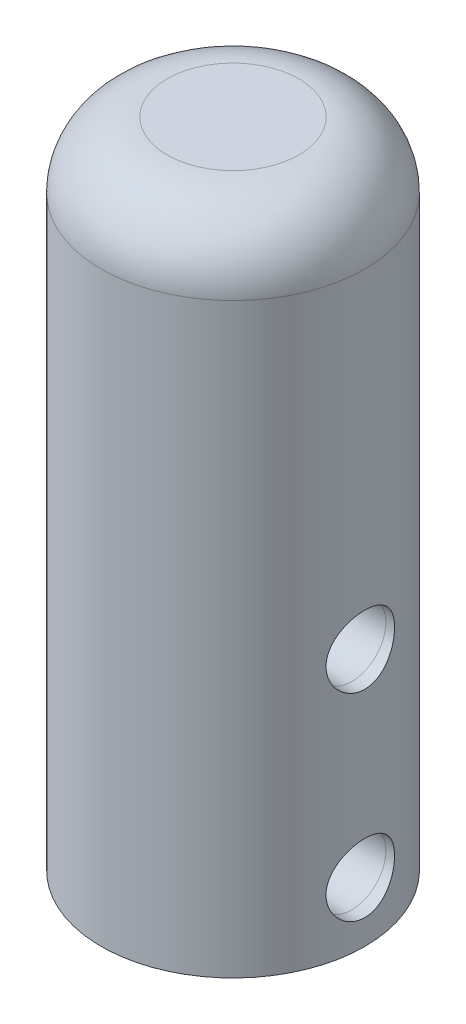
ISO-10303-21;
HEADER;
FILE_DESCRIPTION(('STEP AP214'),'2;1');
FILE_NAME('part.step','',(''),(''),'','','');
FILE_SCHEMA(('AUTOMOTIVE_DESIGN { 1 0 10303 214 1 1 1 1 }'));
ENDSEC;
DATA;
#1=APPLICATION_CONTEXT('core data for automotive mechanical design processes');
#2=APPLICATION_PROTOCOL_DEFINITION('international standard','automotive_design',2000,#1);
#3=PRODUCT_CONTEXT('',#1,'mechanical');
#4=PRODUCT('Part','Part','',(#3));
#5=PRODUCT_RELATED_PRODUCT_CATEGORY('part','',(#4));
#6=PRODUCT_DEFINITION_FORMATION('','',#4);
#7=PRODUCT_DEFINITION_CONTEXT('part definition',#1,'design');
#8=PRODUCT_DEFINITION('design','',#6,#7);
#9=PRODUCT_DEFINITION_SHAPE('','',#8);
#10=(LENGTH_UNIT() NAMED_UNIT(*) SI_UNIT(.MILLI.,.METRE.));
#11=(NAMED_UNIT(*) PLANE_ANGLE_UNIT() SI_UNIT($,.RADIAN.));
#12=(NAMED_UNIT(*) SI_UNIT($,.STERADIAN.) SOLID_ANGLE_UNIT());
#13=UNCERTAINTY_MEASURE_WITH_UNIT(LENGTH_MEASURE(1.E-05),#10,'distance_accuracy_value','');
#14=(GEOMETRIC_REPRESENTATION_CONTEXT(3) GLOBAL_UNCERTAINTY_ASSIGNED_CONTEXT((#13)) GLOBAL_UNIT_ASSIGNED_CONTEXT((#10,
#11,#12)) REPRESENTATION_CONTEXT('',''));
#15=CARTESIAN_POINT('',(0.,0.,0.));
#16=DIRECTION('',(0.,0.,1.));
#17=DIRECTION('',(1.,0.,0.));
#18=AXIS2_PLACEMENT_3D('',#15,#16,#17);
#19=CARTESIAN_POINT('',(-33.645,95.,0.));
#20=DIRECTION('',(1.,0.,0.));
#21=DIRECTION('',(0.,0.,1.));
#22=AXIS2_PLACEMENT_3D('',#19,#20,#21);
#23=CYLINDRICAL_SURFACE('',#22,1.70000000000001);
#24=CARTESIAN_POINT('',(-27.545,95.,0.));
#25=DIRECTION('',(1.,0.,0.));
#26=DIRECTION('',(0.,-1.,0.));
#27=AXIS2_PLACEMENT_3D('',#24,#25,#26);
#28=CIRCLE('',#27,1.70000000000001);
#29=CARTESIAN_POINT('',(-27.545,93.3,0.));
#30=VERTEX_POINT('',#29);
#31=EDGE_CURVE('E154',#30,#30,#28,.T.);
#32=ORIENTED_EDGE('',*,*,#31,.T.);
#33=EDGE_LOOP('',(#32));
#34=FACE_BOUND('',#33,.T.);
#35=CARTESIAN_POINT('',(-30.145,95.,0.));
#36=DIRECTION('',(1.,0.,0.));
#37=DIRECTION('',(0.,-1.,0.));
#38=AXIS2_PLACEMENT_3D('',#35,#36,#37);
#39=CIRCLE('',#38,1.70000000000001);
#40=CARTESIAN_POINT('',(-30.145,93.3,0.));
#41=VERTEX_POINT('',#40);
#42=EDGE_CURVE('E205',#41,#41,#39,.F.);
#43=ORIENTED_EDGE('',*,*,#42,.T.);
#44=EDGE_LOOP('',(#43));
#45=FACE_BOUND('',#44,.T.);
#46=ADVANCED_FACE('F41',(#34,#45),#23,.F.);
#47=CARTESIAN_POINT('',(-33.645,80.,0.));
#48=DIRECTION('',(1.,0.,0.));
#49=DIRECTION('',(0.,0.,1.));
#50=AXIS2_PLACEMENT_3D('',#47,#48,#49);
#51=CYLINDRICAL_SURFACE('',#50,1.70000000000001);
#52=CARTESIAN_POINT('',(-27.545,80.,0.));
#53=DIRECTION('',(1.,0.,0.));
#54=DIRECTION('',(0.,-1.,0.));
#55=AXIS2_PLACEMENT_3D('',#52,#53,#54);
#56=CIRCLE('',#55,1.70000000000001);
#57=CARTESIAN_POINT('',(-27.545,78.3,0.));
#58=VERTEX_POINT('',#57);
#59=EDGE_CURVE('E128',#58,#58,#56,.T.);
#60=ORIENTED_EDGE('',*,*,#59,.T.);
#61=EDGE_LOOP('',(#60));
#62=FACE_BOUND('',#61,.T.);
#63=CARTESIAN_POINT('',(-30.145,80.,0.));
#64=DIRECTION('',(1.,0.,0.));
#65=DIRECTION('',(0.,-1.,0.));
#66=AXIS2_PLACEMENT_3D('',#63,#64,#65);
#67=CIRCLE('',#66,1.70000000000001);
#68=CARTESIAN_POINT('',(-30.145,78.3,0.));
#69=VERTEX_POINT('',#68);
#70=EDGE_CURVE('E344',#69,#69,#67,.F.);
#71=ORIENTED_EDGE('',*,*,#70,.T.);
#72=EDGE_LOOP('',(#71));
#73=FACE_BOUND('',#72,.T.);
#74=ADVANCED_FACE('F192',(#62,#73),#51,.F.);
#75=CARTESIAN_POINT('',(-23.645,46.7157287525381,0.));
#76=DIRECTION('',(0.,1.,0.));
#77=DIRECTION('',(-1.,0.,0.));
#78=AXIS2_PLACEMENT_3D('',#75,#76,#77);
#79=CYLINDRICAL_SURFACE('',#78,10.);
#80=CARTESIAN_POINT('',(-33.645,77.15,0.));
#81=CARTESIAN_POINT('',(-33.6449981148392,77.1500028038685,-0.156702222055426));
#82=CARTESIAN_POINT('',(-33.6412809618987,77.1629670882105,-0.313433312054446));
#83=CARTESIAN_POINT('',(-33.6268145988117,77.2143732014747,-0.622353947826402));
#84=CARTESIAN_POINT('',(-33.6160626998475,77.2528247722106,-0.774541733793407));
#85=CARTESIAN_POINT('',(-33.5887089739797,77.3538338829002,-1.06987393942644));
#86=CARTESIAN_POINT('',(-33.5721152825365,77.4163579100891,-1.21303061082524));
#87=CARTESIAN_POINT('',(-33.5348159939189,77.5636057144373,-1.48682768012773));
#88=CARTESIAN_POINT('',(-33.5141099724456,77.6483317826304,-1.6174667844396));
#89=CARTESIAN_POINT('',(-33.4702011748781,77.8399174044409,-1.86593929261577));
#90=CARTESIAN_POINT('',(-33.4469510780771,77.9472512808776,-1.98339859784889));
#91=CARTESIAN_POINT('',(-33.400866628841,78.1799934404885,-2.1989173339478));
#92=CARTESIAN_POINT('',(-33.3780323388465,78.3054044134504,-2.29697387261132));
#93=CARTESIAN_POINT('',(-33.334872119392,78.5738227536689,-2.47280459739312));
#94=CARTESIAN_POINT('',(-33.3146054240114,78.7171316385792,-2.55013438673269));
#95=CARTESIAN_POINT('',(-33.2795770599847,79.0153892871087,-2.67944864193718));
#96=CARTESIAN_POINT('',(-33.2648142138603,79.170335552527,-2.73143852968244));
#97=CARTESIAN_POINT('',(-33.2429560752628,79.4832944949959,-2.80727118973494));
#98=CARTESIAN_POINT('',(-33.2356747031502,79.6411279762955,-2.83179848433712));
#99=CARTESIAN_POINT('',(-33.2290492312009,79.9588245656897,-2.85414576761167));
#100=CARTESIAN_POINT('',(-33.2297034162181,80.1186872277472,-2.85197152740062));
#101=CARTESIAN_POINT('',(-33.2387094658298,80.4304435713915,-2.82151778088379));
#102=CARTESIAN_POINT('',(-33.2468125321654,80.5824280254272,-2.79408198213026));
#103=CARTESIAN_POINT('',(-33.2694027480574,80.879541178131,-2.71524157426037));
#104=CARTESIAN_POINT('',(-33.2838904721658,81.0246692584959,-2.66383480798507));
#105=CARTESIAN_POINT('',(-33.317825415122,81.3060761777278,-2.53786006677916));
#106=CARTESIAN_POINT('',(-33.3373328525366,81.4422203966578,-2.46300828391955));
#107=CARTESIAN_POINT('',(-33.3790787056095,81.7003050264222,-2.29246582180281));
#108=CARTESIAN_POINT('',(-33.4013177260943,81.822242279864,-2.19677052373737));
#109=CARTESIAN_POINT('',(-33.4470424004349,82.053253779884,-1.98300978221846));
#110=CARTESIAN_POINT('',(-33.4705435339757,82.1616744275809,-1.86424019424136));
#111=CARTESIAN_POINT('',(-33.5154015954441,82.3572031477741,-1.60991372563512));
#112=CARTESIAN_POINT('',(-33.5367584133177,82.4443101267055,-1.47435598417412));
#113=CARTESIAN_POINT('',(-33.5750854943689,82.5950843086651,-1.18919510835358));
#114=CARTESIAN_POINT('',(-33.5920307943484,82.6586189490998,-1.0395183061524));
#115=CARTESIAN_POINT('',(-33.6194456606564,82.759427205276,-0.731011523282429));
#116=CARTESIAN_POINT('',(-33.6299168506962,82.7967074059756,-0.572183848591747));
#117=CARTESIAN_POINT('',(-33.64295204675,82.8428892069603,-0.255450137061612));
#118=CARTESIAN_POINT('',(-33.645763127856,82.8526778714578,-0.0976834116708369));
#119=CARTESIAN_POINT('',(-33.643879508611,82.8460680946158,0.217242667325456));
#120=CARTESIAN_POINT('',(-33.6391857039904,82.8296727784125,0.374402091170115));
#121=CARTESIAN_POINT('',(-33.6229805542209,82.7718828957831,0.680388673532275));
#122=CARTESIAN_POINT('',(-33.6116076772171,82.7309957507387,0.829319683438056));
#123=CARTESIAN_POINT('',(-33.5833471400501,82.6259834606804,1.11818480443486));
#124=CARTESIAN_POINT('',(-33.5664588435169,82.5618556340586,1.25811787511105));
#125=CARTESIAN_POINT('',(-33.5284781124918,82.4106215774358,1.52836402911181));
#126=CARTESIAN_POINT('',(-33.5073028451789,82.3230494984291,1.65840447139229));
#127=CARTESIAN_POINT('',(-33.4631882997216,82.1279876497973,1.90225112974461));
#128=CARTESIAN_POINT('',(-33.4402486230098,82.0204933721145,2.01605366111468));
#129=CARTESIAN_POINT('',(-33.394260008835,81.7844809588745,2.2280240601088));
#130=CARTESIAN_POINT('',(-33.3712317967246,81.6553926188928,2.32556282592988));
#131=CARTESIAN_POINT('',(-33.3284789462253,81.3821839017703,2.49762376402124));
#132=CARTESIAN_POINT('',(-33.3087541917639,81.2380640530756,2.57214674506747));
#133=CARTESIAN_POINT('',(-33.2750719491178,80.9394869051802,2.69551617836587));
#134=CARTESIAN_POINT('',(-33.2610838384091,80.7850897473861,2.74449935465378));
#135=CARTESIAN_POINT('',(-33.2404929669959,80.4697741402036,2.81565501674798));
#136=CARTESIAN_POINT('',(-33.2338879824498,80.3088576696121,2.83783557582512));
#137=CARTESIAN_POINT('',(-33.2290151857934,79.9915613908078,2.85424530598091));
#138=CARTESIAN_POINT('',(-33.2304435556662,79.8352381911743,2.84949301248772));
#139=CARTESIAN_POINT('',(-33.2407548946365,79.5257203473321,2.81457143016976));
#140=CARTESIAN_POINT('',(-33.249637617306,79.3725255998736,2.78440298155919));
#141=CARTESIAN_POINT('',(-33.2736633040637,79.0751001214109,2.70013313019527));
#142=CARTESIAN_POINT('',(-33.288742154251,78.9307945000729,2.64627644900901));
#143=CARTESIAN_POINT('',(-33.3234550958769,78.6531536453183,2.51634821674443));
#144=CARTESIAN_POINT('',(-33.343089990017,78.5198203506631,2.44027275046273));
#145=CARTESIAN_POINT('',(-33.385517454381,78.2631191958515,2.26510160216744));
#146=CARTESIAN_POINT('',(-33.4083932811756,78.1402298043768,2.1653248810925));
#147=CARTESIAN_POINT('',(-33.4542940368548,77.9126080678025,1.94684135338568));
#148=CARTESIAN_POINT('',(-33.4773190017817,77.8078802956592,1.82812979350982));
#149=CARTESIAN_POINT('',(-33.521626524702,77.6169103978416,1.57149897377278));
#150=CARTESIAN_POINT('',(-33.5428497251346,77.5312073812228,1.43316731635174));
#151=CARTESIAN_POINT('',(-33.5804813215053,77.3844027482626,1.14345443992414));
#152=CARTESIAN_POINT('',(-33.5968923652489,77.3232875959628,0.992080456782535));
#153=CARTESIAN_POINT('',(-33.6212939720349,77.234042867142,0.701381500770176));
#154=CARTESIAN_POINT('',(-33.6301143880413,77.2026063509377,0.563133223252123));
#155=CARTESIAN_POINT('',(-33.6419678712141,77.1605850294216,0.283264193504875));
#156=CARTESIAN_POINT('',(-33.6450017040059,77.1499974655699,0.141643889940742));
#157=CARTESIAN_POINT('',(-33.645,77.15,0.));
#158=B_SPLINE_CURVE_WITH_KNOTS('',3,(#80,#81,#82,#83,#84,#85,#86,#87,#88,#89,#90,#91,#92,#93,
#94,#95,#96,#97,#98,#99,#100,#101,#102,#103,#104,#105,#106,#107,#108,#109,#110,#111,#112,#113,
#114,#115,#116,#117,#118,#119,#120,#121,#122,#123,#124,#125,#126,#127,#128,#129,#130,#131,#132,
#133,#134,#135,#136,#137,#138,#139,#140,#141,#142,#143,#144,#145,#146,#147,#148,#149,#150,#151,
#152,#153,#154,#155,#156,#157),.UNSPECIFIED.,.T.,.F.,(4,2,2,2,2,2,2,2,2,2,2,2,2,2,2,2,2,2,2,2,2,
2,2,2,2,2,2,2,2,2,2,2,2,2,2,2,2,2,4),(0.,0.469586772016726,0.939353134230501,1.40846785651064,
1.87763100592849,2.35784471960703,2.83812996074797,3.32801152259435,3.81778822032061,
4.29506452214758,4.77223767002792,5.23403014041426,5.69586417575035,6.16352023552507,
6.63128003093134,7.1165757570095,7.60189637749444,8.08990632613343,8.57779383184113,
9.04974721363853,9.5216442706044,9.98408723231445,10.4465835696392,10.9190568973545,
11.3916372686433,11.8795923255132,12.3675302336642,12.8528284926698,13.3379805375326,
13.8049107773458,14.2718255818576,14.7340260451179,15.1963080025615,15.6739537080073,
16.1517195069052,16.641660830568,17.1313320644874,17.5558499715394,17.9803117065468),.UNSPECIFIED.);
#159=CARTESIAN_POINT('',(-33.645,77.15,0.));
#160=VERTEX_POINT('',#159);
#161=EDGE_CURVE('E11',#160,#160,#158,.T.);
#162=ORIENTED_EDGE('',*,*,#161,.T.);
#163=EDGE_LOOP('',(#162));
#164=FACE_BOUND('',#163,.T.);
#165=CARTESIAN_POINT('',(-33.645,92.15,0.));
#166=CARTESIAN_POINT('',(-33.6449981148392,92.1500028038684,-0.156702222055426));
#167=CARTESIAN_POINT('',(-33.6412809618987,92.1629670882105,-0.313433312054446));
#168=CARTESIAN_POINT('',(-33.6268145988117,92.2143732014747,-0.622353947826402));
#169=CARTESIAN_POINT('',(-33.6160626998475,92.2528247722106,-0.774541733793407));
#170=CARTESIAN_POINT('',(-33.5887089739797,92.3538338829002,-1.06987393942644));
#171=CARTESIAN_POINT('',(-33.5721152825365,92.4163579100891,-1.21303061082524));
#172=CARTESIAN_POINT('',(-33.5348159939189,92.5636057144373,-1.48682768012773));
#173=CARTESIAN_POINT('',(-33.5141099724456,92.6483317826304,-1.6174667844396));
#174=CARTESIAN_POINT('',(-33.4702011748781,92.8399174044409,-1.86593929261578));
#175=CARTESIAN_POINT('',(-33.4469510780771,92.9472512808776,-1.9833985978489));
#176=CARTESIAN_POINT('',(-33.400866628841,93.1799934404885,-2.19891733394781));
#177=CARTESIAN_POINT('',(-33.3780323388465,93.3054044134504,-2.29697387261132));
#178=CARTESIAN_POINT('',(-33.334872119392,93.5738227536689,-2.47280459739312));
#179=CARTESIAN_POINT('',(-33.3146054240114,93.7171316385792,-2.55013438673268));
#180=CARTESIAN_POINT('',(-33.2795770599847,94.0153892871087,-2.67944864193718));
#181=CARTESIAN_POINT('',(-33.2648142138603,94.170335552527,-2.73143852968244));
#182=CARTESIAN_POINT('',(-33.2429560752628,94.4832944949959,-2.80727118973494));
#183=CARTESIAN_POINT('',(-33.2356747031502,94.6411279762955,-2.83179848433712));
#184=CARTESIAN_POINT('',(-33.2290492312009,94.9588245656897,-2.85414576761167));
#185=CARTESIAN_POINT('',(-33.2297034162181,95.1186872277472,-2.85197152740062));
#186=CARTESIAN_POINT('',(-33.2387094658298,95.4304435713915,-2.82151778088379));
#187=CARTESIAN_POINT('',(-33.2468125321654,95.5824280254272,-2.79408198213026));
#188=CARTESIAN_POINT('',(-33.2694027480574,95.879541178131,-2.71524157426037));
#189=CARTESIAN_POINT('',(-33.2838904721658,96.0246692584959,-2.66383480798507));
#190=CARTESIAN_POINT('',(-33.317825415122,96.3060761777278,-2.53786006677916));
#191=CARTESIAN_POINT('',(-33.3373328525366,96.4422203966578,-2.46300828391955));
#192=CARTESIAN_POINT('',(-33.3790787056095,96.7003050264222,-2.29246582180281));
#193=CARTESIAN_POINT('',(-33.4013177260943,96.822242279864,-2.19677052373737));
#194=CARTESIAN_POINT('',(-33.4470424004349,97.053253779884,-1.98300978221846));
#195=CARTESIAN_POINT('',(-33.4705435339757,97.1616744275809,-1.86424019424136));
#196=CARTESIAN_POINT('',(-33.5154015954441,97.3572031477741,-1.60991372563512));
#197=CARTESIAN_POINT('',(-33.5367584133177,97.4443101267055,-1.47435598417412));
#198=CARTESIAN_POINT('',(-33.5750854943689,97.5950843086651,-1.18919510835358));
#199=CARTESIAN_POINT('',(-33.5920307943484,97.6586189490998,-1.0395183061524));
#200=CARTESIAN_POINT('',(-33.6194456606564,97.759427205276,-0.731011523282429));
#201=CARTESIAN_POINT('',(-33.6299168506962,97.7967074059756,-0.572183848591747));
#202=CARTESIAN_POINT('',(-33.64295204675,97.8428892069603,-0.255450137061612));
#203=CARTESIAN_POINT('',(-33.645763127856,97.8526778714578,-0.0976834116708369));
#204=CARTESIAN_POINT('',(-33.643879508611,97.8460680946158,0.217242667325456));
#205=CARTESIAN_POINT('',(-33.6391857039904,97.8296727784125,0.374402091170115));
#206=CARTESIAN_POINT('',(-33.6229805542209,97.771882895783,0.680388673532275));
#207=CARTESIAN_POINT('',(-33.6116076772171,97.7309957507387,0.829319683438056));
#208=CARTESIAN_POINT('',(-33.5833471400501,97.6259834606804,1.11818480443486));
#209=CARTESIAN_POINT('',(-33.5664588435169,97.5618556340586,1.25811787511105));
#210=CARTESIAN_POINT('',(-33.5284781124918,97.4106215774357,1.52836402911181));
#211=CARTESIAN_POINT('',(-33.5073028451789,97.3230494984291,1.6584044713923));
#212=CARTESIAN_POINT('',(-33.4631882997216,97.1279876497972,1.90225112974461));
#213=CARTESIAN_POINT('',(-33.4402486230098,97.0204933721144,2.01605366111469));
#214=CARTESIAN_POINT('',(-33.394260008835,96.7844809588745,2.2280240601088));
#215=CARTESIAN_POINT('',(-33.3712317967246,96.6553926188928,2.32556282592988));
#216=CARTESIAN_POINT('',(-33.3284789462253,96.3821839017703,2.49762376402124));
#217=CARTESIAN_POINT('',(-33.3087541917639,96.2380640530756,2.57214674506747));
#218=CARTESIAN_POINT('',(-33.2750719491178,95.9394869051802,2.69551617836587));
#219=CARTESIAN_POINT('',(-33.2610838384091,95.7850897473861,2.74449935465378));
#220=CARTESIAN_POINT('',(-33.2404929669959,95.4697741402036,2.81565501674798));
#221=CARTESIAN_POINT('',(-33.2338879824498,95.3088576696121,2.83783557582512));
#222=CARTESIAN_POINT('',(-33.2290151857934,94.9915613908078,2.85424530598091));
#223=CARTESIAN_POINT('',(-33.2304435556662,94.8352381911743,2.84949301248772));
#224=CARTESIAN_POINT('',(-33.2407548946365,94.5257203473321,2.81457143016976));
#225=CARTESIAN_POINT('',(-33.249637617306,94.3725255998736,2.78440298155919));
#226=CARTESIAN_POINT('',(-33.2736633040637,94.0751001214109,2.70013313019527));
#227=CARTESIAN_POINT('',(-33.288742154251,93.9307945000728,2.64627644900901));
#228=CARTESIAN_POINT('',(-33.3234550958769,93.6531536453183,2.51634821674443));
#229=CARTESIAN_POINT('',(-33.343089990017,93.5198203506631,2.44027275046273));
#230=CARTESIAN_POINT('',(-33.385517454381,93.2631191958515,2.26510160216744));
#231=CARTESIAN_POINT('',(-33.4083932811756,93.1402298043768,2.1653248810925));
#232=CARTESIAN_POINT('',(-33.4542940368548,92.9126080678024,1.94684135338568));
#233=CARTESIAN_POINT('',(-33.4773190017817,92.8078802956592,1.82812979350982));
#234=CARTESIAN_POINT('',(-33.521626524702,92.6169103978416,1.57149897377278));
#235=CARTESIAN_POINT('',(-33.5428497251346,92.5312073812228,1.43316731635174));
#236=CARTESIAN_POINT('',(-33.5804813215053,92.3844027482626,1.14345443992414));
#237=CARTESIAN_POINT('',(-33.5968923652489,92.3232875959628,0.992080456782535));
#238=CARTESIAN_POINT('',(-33.6212939720349,92.234042867142,0.701381500770176));
#239=CARTESIAN_POINT('',(-33.6301143880413,92.2026063509377,0.563133223252123));
#240=CARTESIAN_POINT('',(-33.6419678712141,92.1605850294216,0.283264193504875));
#241=CARTESIAN_POINT('',(-33.6450017040059,92.1499974655699,0.141643889940742));
#242=CARTESIAN_POINT('',(-33.645,92.15,0.));
#243=B_SPLINE_CURVE_WITH_KNOTS('',3,(#165,#166,#167,#168,#169,#170,#171,#172,#173,#174,#175,
#176,#177,#178,#179,#180,#181,#182,#183,#184,#185,#186,#187,#188,#189,#190,#191,#192,#193,#194,
#195,#196,#197,#198,#199,#200,#201,#202,#203,#204,#205,#206,#207,#208,#209,#210,#211,#212,#213,
#214,#215,#216,#217,#218,#219,#220,#221,#222,#223,#224,#225,#226,#227,#228,#229,#230,#231,#232,
#233,#234,#235,#236,#237,#238,#239,#240,#241,#242),.UNSPECIFIED.,.T.,.F.,(4,2,2,2,2,2,2,2,2,2,2,
2,2,2,2,2,2,2,2,2,2,2,2,2,2,2,2,2,2,2,2,2,2,2,2,2,2,2,4),(0.,0.469586772016726,
0.939353134230501,1.40846785651064,1.87763100592849,2.35784471960705,2.83812996074797,
3.32801152259433,3.81778822032061,4.29506452214758,4.77223767002792,5.23403014041426,
5.69586417575035,6.16352023552507,6.63128003093134,7.1165757570095,7.60189637749444,
8.08990632613343,8.57779383184113,9.04974721363853,9.5216442706044,9.98408723231445,
10.4465835696392,10.9190568973545,11.3916372686433,11.8795923255132,12.3675302336642,
12.8528284926698,13.3379805375326,13.8049107773458,14.2718255818576,14.7340260451179,
15.1963080025615,15.6739537080073,16.1517195069052,16.641660830568,17.1313320644874,
17.5558499715394,17.9803117065468),.UNSPECIFIED.);
#244=CARTESIAN_POINT('',(-33.645,92.15,0.));
#245=VERTEX_POINT('',#244);
#246=EDGE_CURVE('E54',#245,#245,#243,.T.);
#247=ORIENTED_EDGE('',*,*,#246,.T.);
#248=EDGE_LOOP('',(#247));
#249=FACE_BOUND('',#248,.T.);
#250=CARTESIAN_POINT('',(-23.645,120.,0.));
#251=DIRECTION('',(0.,-1.,0.));
#252=DIRECTION('',(-1.,0.,0.));
#253=AXIS2_PLACEMENT_3D('',#250,#251,#252);
#254=CIRCLE('',#253,10.);
#255=CARTESIAN_POINT('',(-33.645,120.,0.));
#256=VERTEX_POINT('',#255);
#257=EDGE_CURVE('E150',#256,#256,#254,.F.);
#258=ORIENTED_EDGE('',*,*,#257,.F.);
#259=EDGE_LOOP('',(#258));
#260=FACE_BOUND('',#259,.T.);
#261=CARTESIAN_POINT('',(-23.645,75.5,0.));
#262=DIRECTION('',(0.,-1.,0.));
#263=DIRECTION('',(-1.,0.,0.));
#264=AXIS2_PLACEMENT_3D('',#261,#262,#263);
#265=CIRCLE('',#264,10.);
#266=CARTESIAN_POINT('',(-33.645,75.5,0.));
#267=VERTEX_POINT('',#266);
#268=EDGE_CURVE('E131',#267,#267,#265,.F.);
#269=ORIENTED_EDGE('',*,*,#268,.T.);
#270=EDGE_LOOP('',(#269));
#271=FACE_BOUND('',#270,.T.);
#272=CARTESIAN_POINT('',(-13.645,97.6,0.));
#273=CARTESIAN_POINT('',(-13.6450022817509,97.5999963317231,0.143461557343221));
#274=CARTESIAN_POINT('',(-13.64811771801,97.5880863541353,0.28696307789456));
#275=CARTESIAN_POINT('',(-13.6602435327051,97.5408401503296,0.569840826995814));
#276=CARTESIAN_POINT('',(-13.6692569527748,97.5054918366635,0.709214888198695));
#277=CARTESIAN_POINT('',(-13.6921825647781,97.4125893881235,0.979712906927253));
#278=CARTESIAN_POINT('',(-13.7060886140724,97.3550630888212,1.11084696748465));
#279=CARTESIAN_POINT('',(-13.7373252444654,97.219538693623,1.36160495984503));
#280=CARTESIAN_POINT('',(-13.7546560084748,97.1415395042172,1.48122827636296));
#281=CARTESIAN_POINT('',(-13.7912956674692,96.9654601813591,1.70821705852408));
#282=CARTESIAN_POINT('',(-13.8106370492413,96.8670115214125,1.81529141719993));
#283=CARTESIAN_POINT('',(-13.8489065334675,96.6536161416951,2.01161083640164));
#284=CARTESIAN_POINT('',(-13.8678345852014,96.5386674101452,2.1008537196379));
#285=CARTESIAN_POINT('',(-13.9034646429184,96.293237022512,2.26037576632186));
#286=CARTESIAN_POINT('',(-13.9201255558058,96.1625336354661,2.33032380649516));
#287=CARTESIAN_POINT('',(-13.9488588383011,95.890719184103,2.44713920878393));
#288=CARTESIAN_POINT('',(-13.9609320077108,95.7496099390124,2.49401059437805));
#289=CARTESIAN_POINT('',(-13.9787880378106,95.4642041010566,2.56233845779895));
#290=CARTESIAN_POINT('',(-13.9847008740128,95.3200417690649,2.58432096580449));
#291=CARTESIAN_POINT('',(-13.989955388155,95.029963539972,2.60388645934352));
#292=CARTESIAN_POINT('',(-13.9892982286793,94.8840479576788,2.601473761695));
#293=CARTESIAN_POINT('',(-13.9816035404561,94.5986805743318,2.57273579210169));
#294=CARTESIAN_POINT('',(-13.9747347943515,94.459159804177,2.54704305477524));
#295=CARTESIAN_POINT('',(-13.9556606012278,94.1864804209399,2.47348576208218));
#296=CARTESIAN_POINT('',(-13.9434547465045,94.0533222947649,2.42561951285409));
#297=CARTESIAN_POINT('',(-13.9149305771421,93.7954800570663,2.30854895360789));
#298=CARTESIAN_POINT('',(-13.8985692617086,93.6709030257153,2.23911972332897));
#299=CARTESIAN_POINT('',(-13.8636012639094,93.4349435602546,2.0810511088295));
#300=CARTESIAN_POINT('',(-13.8449941596756,93.3235636130092,1.99240811283475));
#301=CARTESIAN_POINT('',(-13.806925268941,93.1135415603956,1.79517679870832));
#302=CARTESIAN_POINT('',(-13.7874548507337,93.0154001785762,1.68605623430295));
#303=CARTESIAN_POINT('',(-13.7503705792726,92.8387102616642,1.45266958333244));
#304=CARTESIAN_POINT('',(-13.732756792229,92.7601624251693,1.32840295697729));
#305=CARTESIAN_POINT('',(-13.7012707105428,92.6246838384352,1.06750110603797));
#306=CARTESIAN_POINT('',(-13.6874135071659,92.5678399164137,0.930818854189984));
#307=CARTESIAN_POINT('',(-13.6651112420614,92.4780790019277,0.649396523784745));
#308=CARTESIAN_POINT('',(-13.6566650579587,92.4451570472841,0.504658123039884));
#309=CARTESIAN_POINT('',(-13.6463047430971,92.4049520362114,0.215508531257719));
#310=CARTESIAN_POINT('',(-13.6442171018159,92.3969877607876,0.0711981359237205));
#311=CARTESIAN_POINT('',(-13.6463121394466,92.4050481541739,-0.216695116771972));
#312=CARTESIAN_POINT('',(-13.6504942045516,92.4210704746868,-0.360278043972309));
#313=CARTESIAN_POINT('',(-13.6645470315387,92.4760893151325,-0.640235323682913));
#314=CARTESIAN_POINT('',(-13.6743244929116,92.5147092622615,-0.776688793417186));
#315=CARTESIAN_POINT('',(-13.698462085878,92.6133927029992,-1.04116971053157));
#316=CARTESIAN_POINT('',(-13.7128227010103,92.6734584592955,-1.16919626712278));
#317=CARTESIAN_POINT('',(-13.7449439446486,92.814615019021,-1.41586198403351));
#318=CARTESIAN_POINT('',(-13.7627635724435,92.8960808785712,-1.53427864310433));
#319=CARTESIAN_POINT('',(-13.7997413850607,93.0772504433254,-1.75600088294379));
#320=CARTESIAN_POINT('',(-13.8188998202943,93.1769575660596,-1.85930362555792));
#321=CARTESIAN_POINT('',(-13.8570288055331,93.3949522056671,-2.05071066291276));
#322=CARTESIAN_POINT('',(-13.875980674093,93.5136648160493,-2.13833539496245));
#323=CARTESIAN_POINT('',(-13.9109848503917,93.7645060665079,-2.29242596803189));
#324=CARTESIAN_POINT('',(-13.9270372831525,93.8966341277341,-2.35889272146548));
#325=CARTESIAN_POINT('',(-13.9542431102903,94.1698722097096,-2.46828068475577));
#326=CARTESIAN_POINT('',(-13.9654251900414,94.3109238760307,-2.51134014205601));
#327=CARTESIAN_POINT('',(-13.9816399064259,94.5986034296297,-2.57303487443038));
#328=CARTESIAN_POINT('',(-13.9866740208217,94.7452299681567,-2.59167601891697));
#329=CARTESIAN_POINT('',(-13.9899037369818,95.0349996674078,-2.60367976027314));
#330=CARTESIAN_POINT('',(-13.9883073770088,95.1781091440358,-2.59781133859025));
#331=CARTESIAN_POINT('',(-13.9789406174438,95.4612225306755,-2.56273659838173));
#332=CARTESIAN_POINT('',(-13.97117036213,95.6012265131811,-2.53353082522869));
#333=CARTESIAN_POINT('',(-13.950451992993,95.8732405538469,-2.4530459325271));
#334=CARTESIAN_POINT('',(-13.9375403610453,96.0052995449597,-2.40192214562752));
#335=CARTESIAN_POINT('',(-13.9079915120375,96.2590636608092,-2.27917380239356));
#336=CARTESIAN_POINT('',(-13.8913537375544,96.3807672326347,-2.20754617828313));
#337=CARTESIAN_POINT('',(-13.8556437151062,96.6140549345384,-2.04346026045225));
#338=CARTESIAN_POINT('',(-13.8365162328283,96.7252590286834,-1.95047359785646));
#339=CARTESIAN_POINT('',(-13.798298905214,96.9307349495758,-1.7473241295585));
#340=CARTESIAN_POINT('',(-13.7792090700424,97.0250026952021,-1.63715719587221));
#341=CARTESIAN_POINT('',(-13.7427610426242,97.1957802922383,-1.40011119788575));
#342=CARTESIAN_POINT('',(-13.725445197005,97.2718966071839,-1.27294157409668));
#343=CARTESIAN_POINT('',(-13.6949524040021,97.4015495987193,-1.00716820299807));
#344=CARTESIAN_POINT('',(-13.6817726748756,97.4551014593616,-0.86857222003418));
#345=CARTESIAN_POINT('',(-13.6628414994333,97.5307254735429,-0.608648981246495));
#346=CARTESIAN_POINT('',(-13.6561985413685,97.5566448140635,-0.488491661745836));
#347=CARTESIAN_POINT('',(-13.6472770085162,97.5912828849897,-0.245565833172077));
#348=CARTESIAN_POINT('',(-13.6449980469093,97.6000031399035,-0.122797556506499));
#349=CARTESIAN_POINT('',(-13.645,97.6,0.));
#350=B_SPLINE_CURVE_WITH_KNOTS('',3,(#272,#273,#274,#275,#276,#277,#278,#279,#280,#281,#282,
#283,#284,#285,#286,#287,#288,#289,#290,#291,#292,#293,#294,#295,#296,#297,#298,#299,#300,#301,
#302,#303,#304,#305,#306,#307,#308,#309,#310,#311,#312,#313,#314,#315,#316,#317,#318,#319,#320,
#321,#322,#323,#324,#325,#326,#327,#328,#329,#330,#331,#332,#333,#334,#335,#336,#337,#338,#339,
#340,#341,#342,#343,#344,#345,#346,#347,#348,#349),.UNSPECIFIED.,.T.,.F.,(4,2,2,2,2,2,2,2,2,2,2,
2,2,2,2,2,2,2,2,2,2,2,2,2,2,2,2,2,2,2,2,2,2,2,2,2,2,2,4),(0.,0.429934474066831,
0.860090843440722,1.28970907235791,1.71935025296284,2.15753633720073,2.59577589293958,
3.04112475628265,3.48639594429567,3.92206951869646,4.35766600046569,4.78177068780135,
5.20590777835264,5.63462664248517,6.06342616653084,6.505492584549,6.94757476196668,
7.39140744168554,7.8351480300438,8.26666626217952,8.69814225126951,9.12262491558317,
9.54715237912454,9.97968392093793,10.4122965813725,10.856462519252,11.3006093003833,
11.7421035592481,12.1834916769672,12.6111370956013,13.0387725208446,13.4634261367134,
13.888143322328,14.3247845723566,14.7615308983275,15.2070257711669,15.652220381372,
16.0202603229323,16.38826764037),.UNSPECIFIED.);
#351=CARTESIAN_POINT('',(-13.645,97.6,0.));
#352=VERTEX_POINT('',#351);
#353=EDGE_CURVE('E153',#352,#352,#350,.T.);
#354=ORIENTED_EDGE('',*,*,#353,.F.);
#355=EDGE_LOOP('',(#354));
#356=FACE_BOUND('',#355,.T.);
#357=CARTESIAN_POINT('',(-13.645,82.6,0.));
#358=CARTESIAN_POINT('',(-13.6450022817509,82.5999963317231,0.143461557343221));
#359=CARTESIAN_POINT('',(-13.64811771801,82.5880863541353,0.28696307789456));
#360=CARTESIAN_POINT('',(-13.6602435327051,82.5408401503296,0.569840826995814));
#361=CARTESIAN_POINT('',(-13.6692569527748,82.5054918366635,0.709214888198695));
#362=CARTESIAN_POINT('',(-13.6921825647781,82.4125893881236,0.979712906927253));
#363=CARTESIAN_POINT('',(-13.7060886140724,82.3550630888212,1.11084696748465));
#364=CARTESIAN_POINT('',(-13.7373252444654,82.219538693623,1.36160495984503));
#365=CARTESIAN_POINT('',(-13.7546560084748,82.1415395042172,1.48122827636296));
#366=CARTESIAN_POINT('',(-13.7912956674692,81.9654601813591,1.70821705852408));
#367=CARTESIAN_POINT('',(-13.8106370492413,81.8670115214125,1.81529141719993));
#368=CARTESIAN_POINT('',(-13.8489065334675,81.6536161416951,2.01161083640164));
#369=CARTESIAN_POINT('',(-13.8678345852014,81.5386674101452,2.1008537196379));
#370=CARTESIAN_POINT('',(-13.9034646429184,81.2932370225121,2.26037576632186));
#371=CARTESIAN_POINT('',(-13.9201255558058,81.1625336354662,2.33032380649516));
#372=CARTESIAN_POINT('',(-13.9488588383011,80.890719184103,2.44713920878393));
#373=CARTESIAN_POINT('',(-13.9609320077108,80.7496099390124,2.49401059437805));
#374=CARTESIAN_POINT('',(-13.9787880378106,80.4642041010566,2.56233845779895));
#375=CARTESIAN_POINT('',(-13.9847008740128,80.3200417690649,2.58432096580449));
#376=CARTESIAN_POINT('',(-13.989955388155,80.029963539972,2.60388645934352));
#377=CARTESIAN_POINT('',(-13.9892982286793,79.8840479576789,2.601473761695));
#378=CARTESIAN_POINT('',(-13.9816035404561,79.5986805743318,2.57273579210169));
#379=CARTESIAN_POINT('',(-13.9747347943515,79.4591598041771,2.54704305477524));
#380=CARTESIAN_POINT('',(-13.9556606012278,79.1864804209399,2.47348576208218));
#381=CARTESIAN_POINT('',(-13.9434547465045,79.0533222947649,2.42561951285409));
#382=CARTESIAN_POINT('',(-13.9149305771421,78.7954800570663,2.30854895360789));
#383=CARTESIAN_POINT('',(-13.8985692617086,78.6709030257153,2.23911972332897));
#384=CARTESIAN_POINT('',(-13.8636012639094,78.4349435602546,2.0810511088295));
#385=CARTESIAN_POINT('',(-13.8449941596756,78.3235636130092,1.99240811283475));
#386=CARTESIAN_POINT('',(-13.806925268941,78.1135415603956,1.79517679870832));
#387=CARTESIAN_POINT('',(-13.7874548507337,78.0154001785762,1.68605623430295));
#388=CARTESIAN_POINT('',(-13.7503705792726,77.8387102616642,1.45266958333244));
#389=CARTESIAN_POINT('',(-13.732756792229,77.7601624251693,1.32840295697729));
#390=CARTESIAN_POINT('',(-13.7012707105428,77.6246838384353,1.06750110603797));
#391=CARTESIAN_POINT('',(-13.6874135071659,77.5678399164137,0.930818854189984));
#392=CARTESIAN_POINT('',(-13.6651112420614,77.4780790019277,0.649396523784745));
#393=CARTESIAN_POINT('',(-13.6566650579587,77.4451570472841,0.504658123039884));
#394=CARTESIAN_POINT('',(-13.6463047430971,77.4049520362114,0.215508531257719));
#395=CARTESIAN_POINT('',(-13.6442171018159,77.3969877607876,0.0711981359237205));
#396=CARTESIAN_POINT('',(-13.6463121394466,77.405048154174,-0.216695116771972));
#397=CARTESIAN_POINT('',(-13.6504942045516,77.4210704746868,-0.360278043972309));
#398=CARTESIAN_POINT('',(-13.6645470315387,77.4760893151326,-0.640235323682913));
#399=CARTESIAN_POINT('',(-13.6743244929116,77.5147092622616,-0.776688793417186));
#400=CARTESIAN_POINT('',(-13.698462085878,77.6133927029992,-1.04116971053157));
#401=CARTESIAN_POINT('',(-13.7128227010103,77.6734584592956,-1.16919626712278));
#402=CARTESIAN_POINT('',(-13.7449439446486,77.814615019021,-1.41586198403351));
#403=CARTESIAN_POINT('',(-13.7627635724435,77.8960808785712,-1.53427864310433));
#404=CARTESIAN_POINT('',(-13.7997413850607,78.0772504433255,-1.75600088294379));
#405=CARTESIAN_POINT('',(-13.8188998202943,78.1769575660596,-1.85930362555792));
#406=CARTESIAN_POINT('',(-13.8570288055331,78.3949522056671,-2.05071066291276));
#407=CARTESIAN_POINT('',(-13.875980674093,78.5136648160493,-2.13833539496246));
#408=CARTESIAN_POINT('',(-13.9109848503917,78.7645060665079,-2.29242596803189));
#409=CARTESIAN_POINT('',(-13.9270372831525,78.8966341277341,-2.35889272146548));
#410=CARTESIAN_POINT('',(-13.9542431102903,79.1698722097096,-2.46828068475577));
#411=CARTESIAN_POINT('',(-13.9654251900414,79.3109238760307,-2.51134014205601));
#412=CARTESIAN_POINT('',(-13.9816399064259,79.5986034296297,-2.57303487443038));
#413=CARTESIAN_POINT('',(-13.9866740208217,79.7452299681567,-2.59167601891697));
#414=CARTESIAN_POINT('',(-13.9899037369818,80.0349996674078,-2.60367976027314));
#415=CARTESIAN_POINT('',(-13.9883073770088,80.1781091440358,-2.59781133859025));
#416=CARTESIAN_POINT('',(-13.9789406174438,80.4612225306755,-2.56273659838173));
#417=CARTESIAN_POINT('',(-13.97117036213,80.6012265131812,-2.53353082522869));
#418=CARTESIAN_POINT('',(-13.950451992993,80.8732405538469,-2.4530459325271));
#419=CARTESIAN_POINT('',(-13.9375403610453,81.0052995449597,-2.40192214562752));
#420=CARTESIAN_POINT('',(-13.9079915120375,81.2590636608092,-2.27917380239356));
#421=CARTESIAN_POINT('',(-13.8913537375544,81.3807672326347,-2.20754617828313));
#422=CARTESIAN_POINT('',(-13.8556437151062,81.6140549345385,-2.04346026045225));
#423=CARTESIAN_POINT('',(-13.8365162328283,81.7252590286834,-1.95047359785646));
#424=CARTESIAN_POINT('',(-13.798298905214,81.9307349495758,-1.7473241295585));
#425=CARTESIAN_POINT('',(-13.7792090700424,82.0250026952021,-1.63715719587221));
#426=CARTESIAN_POINT('',(-13.7427610426242,82.1957802922383,-1.40011119788575));
#427=CARTESIAN_POINT('',(-13.725445197005,82.2718966071839,-1.27294157409668));
#428=CARTESIAN_POINT('',(-13.6949524040021,82.4015495987193,-1.00716820299807));
#429=CARTESIAN_POINT('',(-13.6817726748756,82.4551014593616,-0.86857222003418));
#430=CARTESIAN_POINT('',(-13.6628414994333,82.5307254735429,-0.608648981246494));
#431=CARTESIAN_POINT('',(-13.6561985413685,82.5566448140635,-0.488491661745834));
#432=CARTESIAN_POINT('',(-13.6472770085162,82.5912828849897,-0.245565833172074));
#433=CARTESIAN_POINT('',(-13.6449980469093,82.6000031399035,-0.122797556506498));
#434=CARTESIAN_POINT('',(-13.645,82.6,0.));
#435=B_SPLINE_CURVE_WITH_KNOTS('',3,(#357,#358,#359,#360,#361,#362,#363,#364,#365,#366,#367,
#368,#369,#370,#371,#372,#373,#374,#375,#376,#377,#378,#379,#380,#381,#382,#383,#384,#385,#386,
#387,#388,#389,#390,#391,#392,#393,#394,#395,#396,#397,#398,#399,#400,#401,#402,#403,#404,#405,
#406,#407,#408,#409,#410,#411,#412,#413,#414,#415,#416,#417,#418,#419,#420,#421,#422,#423,#424,
#425,#426,#427,#428,#429,#430,#431,#432,#433,#434),.UNSPECIFIED.,.T.,.F.,(4,2,2,2,2,2,2,2,2,2,2,
2,2,2,2,2,2,2,2,2,2,2,2,2,2,2,2,2,2,2,2,2,2,2,2,2,2,2,4),(0.,0.429934474066831,
0.860090843440722,1.28970907235791,1.71935025296284,2.15753633720073,2.59577589293958,
3.04112475628265,3.48639594429567,3.92206951869646,4.35766600046569,4.78177068780135,
5.20590777835264,5.63462664248517,6.06342616653084,6.505492584549,6.94757476196668,
7.39140744168554,7.8351480300438,8.26666626217952,8.69814225126951,9.12262491558317,
9.54715237912454,9.97968392093793,10.4122965813725,10.856462519252,11.3006093003833,
11.7421035592481,12.1834916769672,12.6111370956013,13.0387725208446,13.4634261367134,
13.888143322328,14.3247845723567,14.7615308983275,15.2070257711669,15.652220381372,
16.0202603229323,16.38826764037),.UNSPECIFIED.);
#436=CARTESIAN_POINT('',(-13.645,82.6,0.));
#437=VERTEX_POINT('',#436);
#438=EDGE_CURVE('E178',#437,#437,#435,.T.);
#439=ORIENTED_EDGE('',*,*,#438,.F.);
#440=EDGE_LOOP('',(#439));
#441=FACE_BOUND('',#440,.T.);
#442=ADVANCED_FACE('F187',(#164,#249,#260,#271,#356,#441),#79,.T.);
#443=CARTESIAN_POINT('',(-19.745,95.,0.));
#444=DIRECTION('',(-1.,0.,0.));
#445=DIRECTION('',(0.,1.,0.));
#446=AXIS2_PLACEMENT_3D('',#443,#444,#445);
#447=CIRCLE('',#446,1.70000000000001);
#448=CARTESIAN_POINT('',(-19.745,96.7,0.));
#449=VERTEX_POINT('',#448);
#450=EDGE_CURVE('E158',#449,#449,#447,.T.);
#451=ORIENTED_EDGE('',*,*,#450,.T.);
#452=EDGE_LOOP('',(#451));
#453=FACE_BOUND('',#452,.T.);
#454=CARTESIAN_POINT('',(-18.545,95.,0.));
#455=DIRECTION('',(-1.,0.,0.));
#456=DIRECTION('',(0.,1.,0.));
#457=AXIS2_PLACEMENT_3D('',#454,#455,#456);
#458=CIRCLE('',#457,1.70000000000001);
#459=CARTESIAN_POINT('',(-18.545,96.7,0.));
#460=VERTEX_POINT('',#459);
#461=EDGE_CURVE('E159',#460,#460,#458,.F.);
#462=ORIENTED_EDGE('',*,*,#461,.T.);
#463=EDGE_LOOP('',(#462));
#464=FACE_BOUND('',#463,.T.);
#465=ADVANCED_FACE('F191',(#453,#464),#23,.F.);
#466=CARTESIAN_POINT('',(-19.745,80.,0.));
#467=DIRECTION('',(-1.,0.,0.));
#468=DIRECTION('',(0.,1.,0.));
#469=AXIS2_PLACEMENT_3D('',#466,#467,#468);
#470=CIRCLE('',#469,1.70000000000001);
#471=CARTESIAN_POINT('',(-19.745,81.7,0.));
#472=VERTEX_POINT('',#471);
#473=EDGE_CURVE('E121',#472,#472,#470,.T.);
#474=ORIENTED_EDGE('',*,*,#473,.T.);
#475=EDGE_LOOP('',(#474));
#476=FACE_BOUND('',#475,.T.);
#477=CARTESIAN_POINT('',(-18.545,80.,0.));
#478=DIRECTION('',(-1.,0.,0.));
#479=DIRECTION('',(0.,1.,0.));
#480=AXIS2_PLACEMENT_3D('',#477,#478,#479);
#481=CIRCLE('',#480,1.70000000000001);
#482=CARTESIAN_POINT('',(-18.545,81.7,0.));
#483=VERTEX_POINT('',#482);
#484=EDGE_CURVE('E163',#483,#483,#481,.F.);
#485=ORIENTED_EDGE('',*,*,#484,.T.);
#486=EDGE_LOOP('',(#485));
#487=FACE_BOUND('',#486,.T.);
#488=ADVANCED_FACE('F242',(#476,#487),#51,.F.);
#489=CARTESIAN_POINT('',(-24.145,46.7157287525381,-4.4));
#490=DIRECTION('',(0.,0.,-1.));
#491=DIRECTION('',(0.,-1.,0.));
#492=AXIS2_PLACEMENT_3D('',#489,#490,#491);
#493=PLANE('',#492);
#494=DIRECTION('',(0.,1.,0.));
#495=VECTOR('',#494,1.);
#496=CARTESIAN_POINT('',(-19.745,46.7157287525381,-4.4));
#497=LINE('',#496,#495);
#498=CARTESIAN_POINT('',(-19.745,75.5,-4.4));
#499=VERTEX_POINT('',#498);
#500=CARTESIAN_POINT('',(-19.745,100.,-4.4));
#501=VERTEX_POINT('',#500);
#502=EDGE_CURVE('E106',#499,#501,#497,.T.);
#503=ORIENTED_EDGE('',*,*,#502,.T.);
#504=DIRECTION('',(1.,0.,0.));
#505=VECTOR('',#504,1.);
#506=CARTESIAN_POINT('',(-24.145,100.,-4.4));
#507=LINE('',#506,#505);
#508=CARTESIAN_POINT('',(-27.545,100.,-4.4));
#509=VERTEX_POINT('',#508);
#510=EDGE_CURVE('E99',#509,#501,#507,.T.);
#511=ORIENTED_EDGE('',*,*,#510,.F.);
#512=DIRECTION('',(0.,1.,0.));
#513=VECTOR('',#512,1.);
#514=CARTESIAN_POINT('',(-27.545,46.7157287525381,-4.4));
#515=LINE('',#514,#513);
#516=CARTESIAN_POINT('',(-27.545,75.5,-4.4));
#517=VERTEX_POINT('',#516);
#518=EDGE_CURVE('E109',#517,#509,#515,.T.);
#519=ORIENTED_EDGE('',*,*,#518,.F.);
#520=DIRECTION('',(-1.,0.,0.));
#521=VECTOR('',#520,1.);
#522=CARTESIAN_POINT('',(-24.145,75.5,-4.4));
#523=LINE('',#522,#521);
#524=EDGE_CURVE('E114',#499,#517,#523,.T.);
#525=ORIENTED_EDGE('',*,*,#524,.F.);
#526=EDGE_LOOP('',(#503,#511,#519,#525));
#527=FACE_BOUND('',#526,.T.);
#528=ADVANCED_FACE('F117',(#527),#493,.F.);
#529=CARTESIAN_POINT('',(-19.745,46.7157287525381,-4.4));
#530=DIRECTION('',(1.,0.,0.));
#531=DIRECTION('',(0.,1.,0.));
#532=AXIS2_PLACEMENT_3D('',#529,#530,#531);
#533=PLANE('',#532);
#534=ORIENTED_EDGE('',*,*,#473,.F.);
#535=EDGE_LOOP('',(#534));
#536=FACE_BOUND('',#535,.T.);
#537=ORIENTED_EDGE('',*,*,#450,.F.);
#538=EDGE_LOOP('',(#537));
#539=FACE_BOUND('',#538,.T.);
#540=DIRECTION('',(0.,1.,0.));
#541=VECTOR('',#540,1.);
#542=CARTESIAN_POINT('',(-19.745,46.7157287525381,4.40000000000001));
#543=LINE('',#542,#541);
#544=CARTESIAN_POINT('',(-19.745,75.5,4.4));
#545=VERTEX_POINT('',#544);
#546=CARTESIAN_POINT('',(-19.745,100.,4.40000000000001));
#547=VERTEX_POINT('',#546);
#548=EDGE_CURVE('E138',#545,#547,#543,.T.);
#549=ORIENTED_EDGE('',*,*,#548,.T.);
#550=DIRECTION('',(0.,0.,1.));
#551=VECTOR('',#550,1.);
#552=CARTESIAN_POINT('',(-19.745,100.,-4.4));
#553=LINE('',#552,#551);
#554=EDGE_CURVE('E120',#501,#547,#553,.T.);
#555=ORIENTED_EDGE('',*,*,#554,.F.);
#556=ORIENTED_EDGE('',*,*,#502,.F.);
#557=DIRECTION('',(0.,0.,-1.));
#558=VECTOR('',#557,1.);
#559=CARTESIAN_POINT('',(-19.745,75.5,-4.4));
#560=LINE('',#559,#558);
#561=EDGE_CURVE('E64',#545,#499,#560,.T.);
#562=ORIENTED_EDGE('',*,*,#561,.F.);
#563=EDGE_LOOP('',(#549,#555,#556,#562));
#564=FACE_BOUND('',#563,.T.);
#565=ADVANCED_FACE('F300',(#536,#539,#564),#533,.F.);
#566=CARTESIAN_POINT('',(-24.145,46.7157287525381,4.40000000000001));
#567=DIRECTION('',(0.,0.,1.));
#568=DIRECTION('',(-1.,0.,0.));
#569=AXIS2_PLACEMENT_3D('',#566,#567,#568);
#570=PLANE('',#569);
#571=DIRECTION('',(0.,1.,0.));
#572=VECTOR('',#571,1.);
#573=CARTESIAN_POINT('',(-27.545,46.7157287525381,4.4));
#574=LINE('',#573,#572);
#575=CARTESIAN_POINT('',(-27.545,75.5,4.4));
#576=VERTEX_POINT('',#575);
#577=CARTESIAN_POINT('',(-27.545,100.,4.4));
#578=VERTEX_POINT('',#577);
#579=EDGE_CURVE('E115',#576,#578,#574,.T.);
#580=ORIENTED_EDGE('',*,*,#579,.T.);
#581=DIRECTION('',(-1.,0.,0.));
#582=VECTOR('',#581,1.);
#583=CARTESIAN_POINT('',(-24.145,100.,4.40000000000001));
#584=LINE('',#583,#582);
#585=EDGE_CURVE('E101',#547,#578,#584,.T.);
#586=ORIENTED_EDGE('',*,*,#585,.F.);
#587=ORIENTED_EDGE('',*,*,#548,.F.);
#588=DIRECTION('',(1.,0.,0.));
#589=VECTOR('',#588,1.);
#590=CARTESIAN_POINT('',(-24.145,75.5,4.40000000000001));
#591=LINE('',#590,#589);
#592=EDGE_CURVE('E70',#576,#545,#591,.T.);
#593=ORIENTED_EDGE('',*,*,#592,.F.);
#594=EDGE_LOOP('',(#580,#586,#587,#593));
#595=FACE_BOUND('',#594,.T.);
#596=ADVANCED_FACE('F298',(#595),#570,.F.);
#597=CARTESIAN_POINT('',(-27.545,46.7157287525381,4.4));
#598=DIRECTION('',(-1.,0.,0.));
#599=DIRECTION('',(0.,-1.,0.));
#600=AXIS2_PLACEMENT_3D('',#597,#598,#599);
#601=PLANE('',#600);
#602=ORIENTED_EDGE('',*,*,#59,.F.);
#603=EDGE_LOOP('',(#602));
#604=FACE_BOUND('',#603,.T.);
#605=ORIENTED_EDGE('',*,*,#31,.F.);
#606=EDGE_LOOP('',(#605));
#607=FACE_BOUND('',#606,.T.);
#608=ORIENTED_EDGE('',*,*,#518,.T.);
#609=DIRECTION('',(0.,0.,-1.));
#610=VECTOR('',#609,1.);
#611=CARTESIAN_POINT('',(-27.545,100.,4.4));
#612=LINE('',#611,#610);
#613=EDGE_CURVE('E94',#578,#509,#612,.T.);
#614=ORIENTED_EDGE('',*,*,#613,.F.);
#615=ORIENTED_EDGE('',*,*,#579,.F.);
#616=DIRECTION('',(0.,0.,1.));
#617=VECTOR('',#616,1.);
#618=CARTESIAN_POINT('',(-27.545,75.5,4.4));
#619=LINE('',#618,#617);
#620=EDGE_CURVE('E111',#517,#576,#619,.T.);
#621=ORIENTED_EDGE('',*,*,#620,.F.);
#622=EDGE_LOOP('',(#608,#614,#615,#621));
#623=FACE_BOUND('',#622,.T.);
#624=ADVANCED_FACE('F110',(#604,#607,#623),#601,.F.);
#625=CARTESIAN_POINT('',(-24.145,75.5,0.));
#626=DIRECTION('',(0.,1.,0.));
#627=DIRECTION('',(-1.,0.,0.));
#628=AXIS2_PLACEMENT_3D('',#625,#626,#627);
#629=PLANE('',#628);
#630=ORIENTED_EDGE('',*,*,#268,.F.);
#631=EDGE_LOOP('',(#630));
#632=FACE_BOUND('',#631,.T.);
#633=ORIENTED_EDGE('',*,*,#524,.T.);
#634=ORIENTED_EDGE('',*,*,#620,.T.);
#635=ORIENTED_EDGE('',*,*,#592,.T.);
#636=ORIENTED_EDGE('',*,*,#561,.T.);
#637=EDGE_LOOP('',(#633,#634,#635,#636));
#638=FACE_BOUND('',#637,.T.);
#639=ADVANCED_FACE('F295',(#632,#638),#629,.F.);
#640=CARTESIAN_POINT('',(-23.645,100.,0.));
#641=DIRECTION('',(0.,1.,0.));
#642=DIRECTION('',(-1.,0.,0.));
#643=AXIS2_PLACEMENT_3D('',#640,#641,#642);
#644=PLANE('',#643);
#645=ORIENTED_EDGE('',*,*,#613,.T.);
#646=ORIENTED_EDGE('',*,*,#510,.T.);
#647=ORIENTED_EDGE('',*,*,#554,.T.);
#648=ORIENTED_EDGE('',*,*,#585,.T.);
#649=EDGE_LOOP('',(#645,#646,#647,#648));
#650=FACE_BOUND('',#649,.T.);
#651=ADVANCED_FACE('F96',(#650),#644,.F.);
#652=CARTESIAN_POINT('',(-23.645,125.,0.));
#653=DIRECTION('',(0.,1.,0.));
#654=DIRECTION('',(-1.,0.,0.));
#655=AXIS2_PLACEMENT_3D('',#652,#653,#654);
#656=PLANE('',#655);
#657=CARTESIAN_POINT('',(-23.645,125.,0.));
#658=DIRECTION('',(0.,-1.,0.));
#659=DIRECTION('',(-1.,0.,0.));
#660=AXIS2_PLACEMENT_3D('',#657,#658,#659);
#661=CIRCLE('',#660,5.);
#662=CARTESIAN_POINT('',(-28.645,125.,0.));
#663=VERTEX_POINT('',#662);
#664=EDGE_CURVE('E146',#663,#663,#661,.T.);
#665=ORIENTED_EDGE('',*,*,#664,.F.);
#666=EDGE_LOOP('',(#665));
#667=FACE_BOUND('',#666,.T.);
#668=ADVANCED_FACE('F318',(#667),#656,.T.);
#669=CARTESIAN_POINT('',(-23.645,120.,0.));
#670=DIRECTION('',(0.,1.,0.));
#671=DIRECTION('',(-1.,0.,0.));
#672=AXIS2_PLACEMENT_3D('',#669,#670,#671);
#673=DEGENERATE_TOROIDAL_SURFACE('',#672,5.,5.,.T.);
#674=ORIENTED_EDGE('',*,*,#257,.T.);
#675=EDGE_LOOP('',(#674));
#676=FACE_BOUND('',#675,.T.);
#677=ORIENTED_EDGE('',*,*,#664,.T.);
#678=EDGE_LOOP('',(#677));
#679=FACE_BOUND('',#678,.T.);
#680=ADVANCED_FACE('F43',(#676,#679),#673,.T.);
#681=CARTESIAN_POINT('',(-18.545,80.,0.));
#682=DIRECTION('',(1.,0.,0.));
#683=DIRECTION('',(0.,1.,0.));
#684=AXIS2_PLACEMENT_3D('',#681,#682,#683);
#685=PLANE('',#684);
#686=CARTESIAN_POINT('',(-18.545,80.,0.));
#687=DIRECTION('',(-1.,0.,0.));
#688=DIRECTION('',(0.,1.,0.));
#689=AXIS2_PLACEMENT_3D('',#686,#687,#688);
#690=CIRCLE('',#689,2.49787490588017);
#691=CARTESIAN_POINT('',(-18.545,82.4978749058802,0.));
#692=VERTEX_POINT('',#691);
#693=EDGE_CURVE('E167',#692,#692,#690,.T.);
#694=ORIENTED_EDGE('',*,*,#693,.F.);
#695=EDGE_LOOP('',(#694));
#696=FACE_BOUND('',#695,.T.);
#697=ORIENTED_EDGE('',*,*,#484,.F.);
#698=EDGE_LOOP('',(#697));
#699=FACE_BOUND('',#698,.T.);
#700=ADVANCED_FACE('F218',(#696,#699),#685,.T.);
#701=CARTESIAN_POINT('',(-13.645,80.,0.));
#702=DIRECTION('',(-1.,0.,0.));
#703=DIRECTION('',(0.,0.,-1.));
#704=AXIS2_PLACEMENT_3D('',#701,#702,#703);
#705=CYLINDRICAL_SURFACE('',#704,2.6);
#706=ORIENTED_EDGE('',*,*,#438,.T.);
#707=EDGE_LOOP('',(#706));
#708=FACE_BOUND('',#707,.T.);
#709=CARTESIAN_POINT('',(-14.645,80.,0.));
#710=DIRECTION('',(-1.,0.,0.));
#711=DIRECTION('',(0.,1.,0.));
#712=AXIS2_PLACEMENT_3D('',#709,#710,#711);
#713=CIRCLE('',#712,2.6);
#714=CARTESIAN_POINT('',(-14.645,82.6,0.));
#715=VERTEX_POINT('',#714);
#716=EDGE_CURVE('E280',#715,#715,#713,.T.);
#717=ORIENTED_EDGE('',*,*,#716,.T.);
#718=EDGE_LOOP('',(#717));
#719=FACE_BOUND('',#718,.T.);
#720=ADVANCED_FACE('F221',(#708,#719),#705,.F.);
#721=CARTESIAN_POINT('',(-14.645,80.,0.));
#722=DIRECTION('',(1.,0.,0.));
#723=DIRECTION('',(0.,1.,0.));
#724=AXIS2_PLACEMENT_3D('',#721,#722,#723);
#725=CONICAL_SURFACE('',#724,2.6,0.026179938779915);
#726=ORIENTED_EDGE('',*,*,#693,.T.);
#727=EDGE_LOOP('',(#726));
#728=FACE_BOUND('',#727,.T.);
#729=ORIENTED_EDGE('',*,*,#716,.F.);
#730=EDGE_LOOP('',(#729));
#731=FACE_BOUND('',#730,.T.);
#732=ADVANCED_FACE('F223',(#728,#731),#725,.F.);
#733=CARTESIAN_POINT('',(-18.545,95.,0.));
#734=DIRECTION('',(1.,0.,0.));
#735=DIRECTION('',(0.,1.,0.));
#736=AXIS2_PLACEMENT_3D('',#733,#734,#735);
#737=PLANE('',#736);
#738=CARTESIAN_POINT('',(-18.545,95.,0.));
#739=DIRECTION('',(-1.,0.,0.));
#740=DIRECTION('',(0.,1.,0.));
#741=AXIS2_PLACEMENT_3D('',#738,#739,#740);
#742=CIRCLE('',#741,2.49787490588017);
#743=CARTESIAN_POINT('',(-18.545,97.4978749058802,0.));
#744=VERTEX_POINT('',#743);
#745=EDGE_CURVE('E274',#744,#744,#742,.T.);
#746=ORIENTED_EDGE('',*,*,#745,.F.);
#747=EDGE_LOOP('',(#746));
#748=FACE_BOUND('',#747,.T.);
#749=ORIENTED_EDGE('',*,*,#461,.F.);
#750=EDGE_LOOP('',(#749));
#751=FACE_BOUND('',#750,.T.);
#752=ADVANCED_FACE('F225',(#748,#751),#737,.T.);
#753=CARTESIAN_POINT('',(-13.645,95.,0.));
#754=DIRECTION('',(-1.,0.,0.));
#755=DIRECTION('',(0.,0.,-1.));
#756=AXIS2_PLACEMENT_3D('',#753,#754,#755);
#757=CYLINDRICAL_SURFACE('',#756,2.6);
#758=ORIENTED_EDGE('',*,*,#353,.T.);
#759=EDGE_LOOP('',(#758));
#760=FACE_BOUND('',#759,.T.);
#761=CARTESIAN_POINT('',(-14.645,95.,0.));
#762=DIRECTION('',(-1.,0.,0.));
#763=DIRECTION('',(0.,1.,0.));
#764=AXIS2_PLACEMENT_3D('',#761,#762,#763);
#765=CIRCLE('',#764,2.6);
#766=CARTESIAN_POINT('',(-14.645,97.6,0.));
#767=VERTEX_POINT('',#766);
#768=EDGE_CURVE('E277',#767,#767,#765,.T.);
#769=ORIENTED_EDGE('',*,*,#768,.T.);
#770=EDGE_LOOP('',(#769));
#771=FACE_BOUND('',#770,.T.);
#772=ADVANCED_FACE('F184',(#760,#771),#757,.F.);
#773=CARTESIAN_POINT('',(-14.645,95.,0.));
#774=DIRECTION('',(1.,0.,0.));
#775=DIRECTION('',(0.,1.,0.));
#776=AXIS2_PLACEMENT_3D('',#773,#774,#775);
#777=CONICAL_SURFACE('',#776,2.6,0.026179938779915);
#778=ORIENTED_EDGE('',*,*,#745,.T.);
#779=EDGE_LOOP('',(#778));
#780=FACE_BOUND('',#779,.T.);
#781=ORIENTED_EDGE('',*,*,#768,.F.);
#782=EDGE_LOOP('',(#781));
#783=FACE_BOUND('',#782,.T.);
#784=ADVANCED_FACE('F262',(#780,#783),#777,.F.);
#785=CARTESIAN_POINT('',(-30.145,80.,0.));
#786=DIRECTION('',(-1.,0.,0.));
#787=DIRECTION('',(0.,-1.,0.));
#788=AXIS2_PLACEMENT_3D('',#785,#786,#787);
#789=PLANE('',#788);
#790=CARTESIAN_POINT('',(-30.145,80.,0.));
#791=DIRECTION('',(1.,0.,0.));
#792=DIRECTION('',(0.,-1.,0.));
#793=AXIS2_PLACEMENT_3D('',#790,#791,#792);
#794=CIRCLE('',#793,2.85);
#795=CARTESIAN_POINT('',(-30.145,77.15,0.));
#796=VERTEX_POINT('',#795);
#797=EDGE_CURVE('E341',#796,#796,#794,.T.);
#798=ORIENTED_EDGE('',*,*,#797,.F.);
#799=EDGE_LOOP('',(#798));
#800=FACE_BOUND('',#799,.T.);
#801=ORIENTED_EDGE('',*,*,#70,.F.);
#802=EDGE_LOOP('',(#801));
#803=FACE_BOUND('',#802,.T.);
#804=ADVANCED_FACE('F266',(#800,#803),#789,.T.);
#805=CARTESIAN_POINT('',(-30.145,80.,0.));
#806=DIRECTION('',(-1.,0.,0.));
#807=DIRECTION('',(0.,0.,-1.));
#808=AXIS2_PLACEMENT_3D('',#805,#806,#807);
#809=CYLINDRICAL_SURFACE('',#808,2.85);
#810=ORIENTED_EDGE('',*,*,#161,.F.);
#811=EDGE_LOOP('',(#810));
#812=FACE_BOUND('',#811,.T.);
#813=ORIENTED_EDGE('',*,*,#797,.T.);
#814=EDGE_LOOP('',(#813));
#815=FACE_BOUND('',#814,.T.);
#816=ADVANCED_FACE('F212',(#812,#815),#809,.F.);
#817=CARTESIAN_POINT('',(-30.145,95.,0.));
#818=DIRECTION('',(-1.,0.,0.));
#819=DIRECTION('',(0.,-1.,0.));
#820=AXIS2_PLACEMENT_3D('',#817,#818,#819);
#821=PLANE('',#820);
#822=CARTESIAN_POINT('',(-30.145,95.,0.));
#823=DIRECTION('',(1.,0.,0.));
#824=DIRECTION('',(0.,-1.,0.));
#825=AXIS2_PLACEMENT_3D('',#822,#823,#824);
#826=CIRCLE('',#825,2.85);
#827=CARTESIAN_POINT('',(-30.145,92.15,0.));
#828=VERTEX_POINT('',#827);
#829=EDGE_CURVE('E345',#828,#828,#826,.T.);
#830=ORIENTED_EDGE('',*,*,#829,.F.);
#831=EDGE_LOOP('',(#830));
#832=FACE_BOUND('',#831,.T.);
#833=ORIENTED_EDGE('',*,*,#42,.F.);
#834=EDGE_LOOP('',(#833));
#835=FACE_BOUND('',#834,.T.);
#836=ADVANCED_FACE('F210',(#832,#835),#821,.T.);
#837=CARTESIAN_POINT('',(-30.145,95.,0.));
#838=DIRECTION('',(-1.,0.,0.));
#839=DIRECTION('',(0.,0.,-1.));
#840=AXIS2_PLACEMENT_3D('',#837,#838,#839);
#841=CYLINDRICAL_SURFACE('',#840,2.85);
#842=ORIENTED_EDGE('',*,*,#246,.F.);
#843=EDGE_LOOP('',(#842));
#844=FACE_BOUND('',#843,.T.);
#845=ORIENTED_EDGE('',*,*,#829,.T.);
#846=EDGE_LOOP('',(#845));
#847=FACE_BOUND('',#846,.T.);
#848=ADVANCED_FACE('F206',(#844,#847),#841,.F.);
#849=CLOSED_SHELL('',(#46,#74,#442,#465,#488,#528,#565,#596,#624,#639,#651,#668,#680,#700,#720,
#732,#752,#772,#784,#804,#816,#836,#848));
#850=MANIFOLD_SOLID_BREP('B2',#849);
#851=ADVANCED_BREP_SHAPE_REPRESENTATION('',(#18,#850),#14);
#852=SHAPE_DEFINITION_REPRESENTATION(#9,#851);
ENDSEC;
END-ISO-10303-21;
